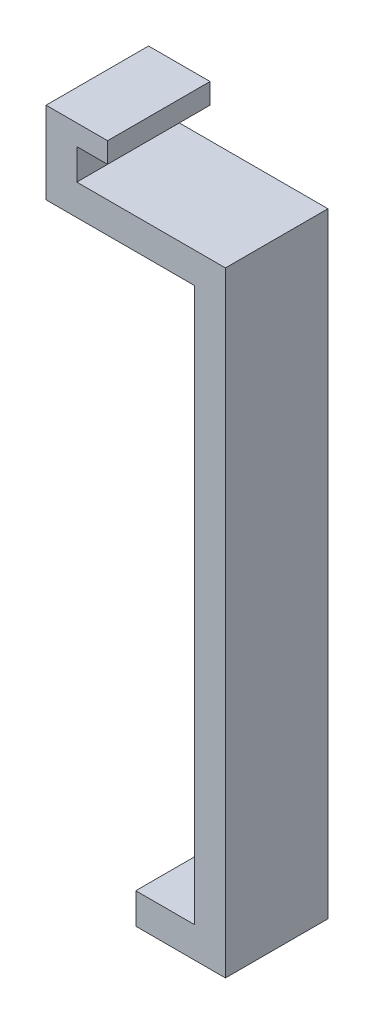
ISO-10303-21;
HEADER;
FILE_DESCRIPTION(('STEP AP214'),'2;1');
FILE_NAME('part.step','',(''),(''),'','','');
FILE_SCHEMA(('AUTOMOTIVE_DESIGN { 1 0 10303 214 1 1 1 1 }'));
ENDSEC;
DATA;
#1=APPLICATION_CONTEXT('core data for automotive mechanical design processes');
#2=APPLICATION_PROTOCOL_DEFINITION('international standard','automotive_design',2000,#1);
#3=PRODUCT_CONTEXT('',#1,'mechanical');
#4=PRODUCT('Part','Part','',(#3));
#5=PRODUCT_RELATED_PRODUCT_CATEGORY('part','',(#4));
#6=PRODUCT_DEFINITION_FORMATION('','',#4);
#7=PRODUCT_DEFINITION_CONTEXT('part definition',#1,'design');
#8=PRODUCT_DEFINITION('design','',#6,#7);
#9=PRODUCT_DEFINITION_SHAPE('','',#8);
#10=(LENGTH_UNIT() NAMED_UNIT(*) SI_UNIT(.MILLI.,.METRE.));
#11=(NAMED_UNIT(*) PLANE_ANGLE_UNIT() SI_UNIT($,.RADIAN.));
#12=(NAMED_UNIT(*) SI_UNIT($,.STERADIAN.) SOLID_ANGLE_UNIT());
#13=UNCERTAINTY_MEASURE_WITH_UNIT(LENGTH_MEASURE(1.E-05),#10,'distance_accuracy_value','');
#14=(GEOMETRIC_REPRESENTATION_CONTEXT(3) GLOBAL_UNCERTAINTY_ASSIGNED_CONTEXT((#13)) GLOBAL_UNIT_ASSIGNED_CONTEXT((#10,
#11,#12)) REPRESENTATION_CONTEXT('',''));
#15=CARTESIAN_POINT('',(0.,0.,0.));
#16=DIRECTION('',(0.,0.,1.));
#17=DIRECTION('',(1.,0.,0.));
#18=AXIS2_PLACEMENT_3D('',#15,#16,#17);
#19=CARTESIAN_POINT('',(-18.2298401554862,32.,10.));
#20=DIRECTION('',(0.,-1.,0.));
#21=DIRECTION('',(0.,0.,-1.));
#22=AXIS2_PLACEMENT_3D('',#19,#20,#21);
#23=PLANE('',#22);
#24=DIRECTION('',(-1.,0.,0.));
#25=VECTOR('',#24,1.);
#26=CARTESIAN_POINT('',(-18.2298401554862,32.,0.));
#27=LINE('',#26,#25);
#28=CARTESIAN_POINT('',(-12.2298401554862,32.,0.));
#29=VERTEX_POINT('',#28);
#30=CARTESIAN_POINT('',(-18.2298401554862,32.,0.));
#31=VERTEX_POINT('',#30);
#32=EDGE_CURVE('E164',#29,#31,#27,.T.);
#33=ORIENTED_EDGE('',*,*,#32,.T.);
#34=DIRECTION('',(0.,0.,-1.));
#35=VECTOR('',#34,1.);
#36=CARTESIAN_POINT('',(-18.2298401554862,32.,10.));
#37=LINE('',#36,#35);
#38=CARTESIAN_POINT('',(-18.2298401554862,32.,10.));
#39=VERTEX_POINT('',#38);
#40=EDGE_CURVE('E11',#39,#31,#37,.T.);
#41=ORIENTED_EDGE('',*,*,#40,.F.);
#42=DIRECTION('',(-1.,0.,0.));
#43=VECTOR('',#42,1.);
#44=CARTESIAN_POINT('',(-18.2298401554862,32.,10.));
#45=LINE('',#44,#43);
#46=CARTESIAN_POINT('',(-12.2298401554862,32.,10.));
#47=VERTEX_POINT('',#46);
#48=EDGE_CURVE('E200',#47,#39,#45,.T.);
#49=ORIENTED_EDGE('',*,*,#48,.F.);
#50=DIRECTION('',(0.,0.,-1.));
#51=VECTOR('',#50,1.);
#52=CARTESIAN_POINT('',(-12.2298401554862,32.,10.));
#53=LINE('',#52,#51);
#54=EDGE_CURVE('E160',#47,#29,#53,.T.);
#55=ORIENTED_EDGE('',*,*,#54,.T.);
#56=EDGE_LOOP('',(#33,#41,#49,#55));
#57=FACE_BOUND('',#56,.T.);
#58=ADVANCED_FACE('F39',(#57),#23,.F.);
#59=CARTESIAN_POINT('',(-18.2298401554862,32.,10.));
#60=DIRECTION('',(1.,0.,0.));
#61=DIRECTION('',(0.,0.,-1.));
#62=AXIS2_PLACEMENT_3D('',#59,#60,#61);
#63=PLANE('',#62);
#64=DIRECTION('',(0.,-1.,0.));
#65=VECTOR('',#64,1.);
#66=CARTESIAN_POINT('',(-18.2298401554862,32.,0.));
#67=LINE('',#66,#65);
#68=CARTESIAN_POINT('',(-18.2298401554862,24.,0.));
#69=VERTEX_POINT('',#68);
#70=EDGE_CURVE('E168',#31,#69,#67,.T.);
#71=ORIENTED_EDGE('',*,*,#70,.T.);
#72=DIRECTION('',(0.,0.,-1.));
#73=VECTOR('',#72,1.);
#74=CARTESIAN_POINT('',(-18.2298401554862,24.,10.));
#75=LINE('',#74,#73);
#76=CARTESIAN_POINT('',(-18.2298401554862,24.,10.));
#77=VERTEX_POINT('',#76);
#78=EDGE_CURVE('E48',#77,#69,#75,.T.);
#79=ORIENTED_EDGE('',*,*,#78,.F.);
#80=DIRECTION('',(0.,-1.,0.));
#81=VECTOR('',#80,1.);
#82=CARTESIAN_POINT('',(-18.2298401554862,32.,10.));
#83=LINE('',#82,#81);
#84=EDGE_CURVE('E111',#39,#77,#83,.T.);
#85=ORIENTED_EDGE('',*,*,#84,.F.);
#86=ORIENTED_EDGE('',*,*,#40,.T.);
#87=EDGE_LOOP('',(#71,#79,#85,#86));
#88=FACE_BOUND('',#87,.T.);
#89=ADVANCED_FACE('F292',(#88),#63,.F.);
#90=CARTESIAN_POINT('',(-18.2298401554862,24.,10.));
#91=DIRECTION('',(0.,1.,0.));
#92=DIRECTION('',(0.,0.,1.));
#93=AXIS2_PLACEMENT_3D('',#90,#91,#92);
#94=PLANE('',#93);
#95=DIRECTION('',(1.,0.,0.));
#96=VECTOR('',#95,1.);
#97=CARTESIAN_POINT('',(-18.2298401554862,24.,0.));
#98=LINE('',#97,#96);
#99=CARTESIAN_POINT('',(-3.72984015548622,24.,0.));
#100=VERTEX_POINT('',#99);
#101=EDGE_CURVE('E171',#69,#100,#98,.T.);
#102=ORIENTED_EDGE('',*,*,#101,.T.);
#103=DIRECTION('',(0.,0.,-1.));
#104=VECTOR('',#103,1.);
#105=CARTESIAN_POINT('',(-3.72984015548622,24.,10.));
#106=LINE('',#105,#104);
#107=CARTESIAN_POINT('',(-3.72984015548622,24.,10.));
#108=VERTEX_POINT('',#107);
#109=EDGE_CURVE('E227',#108,#100,#106,.T.);
#110=ORIENTED_EDGE('',*,*,#109,.F.);
#111=DIRECTION('',(1.,0.,0.));
#112=VECTOR('',#111,1.);
#113=CARTESIAN_POINT('',(-18.2298401554862,24.,10.));
#114=LINE('',#113,#112);
#115=EDGE_CURVE('E237',#77,#108,#114,.T.);
#116=ORIENTED_EDGE('',*,*,#115,.F.);
#117=ORIENTED_EDGE('',*,*,#78,.T.);
#118=EDGE_LOOP('',(#102,#110,#116,#117));
#119=FACE_BOUND('',#118,.T.);
#120=ADVANCED_FACE('F235',(#119),#94,.F.);
#121=CARTESIAN_POINT('',(-3.72984015548622,0.,10.));
#122=DIRECTION('',(1.,0.,0.));
#123=DIRECTION('',(0.,1.,0.));
#124=AXIS2_PLACEMENT_3D('',#121,#122,#123);
#125=PLANE('',#124);
#126=DIRECTION('',(0.,-1.,0.));
#127=VECTOR('',#126,1.);
#128=CARTESIAN_POINT('',(-3.72984015548622,0.,0.));
#129=LINE('',#128,#127);
#130=CARTESIAN_POINT('',(-3.72984015548621,-30.,0.));
#131=VERTEX_POINT('',#130);
#132=EDGE_CURVE('E175',#100,#131,#129,.T.);
#133=ORIENTED_EDGE('',*,*,#132,.T.);
#134=DIRECTION('',(0.,0.,-1.));
#135=VECTOR('',#134,1.);
#136=CARTESIAN_POINT('',(-3.72984015548621,-30.,10.));
#137=LINE('',#136,#135);
#138=CARTESIAN_POINT('',(-3.72984015548621,-30.,10.));
#139=VERTEX_POINT('',#138);
#140=EDGE_CURVE('E223',#139,#131,#137,.T.);
#141=ORIENTED_EDGE('',*,*,#140,.F.);
#142=DIRECTION('',(0.,-1.,0.));
#143=VECTOR('',#142,1.);
#144=CARTESIAN_POINT('',(-3.72984015548622,24.,10.));
#145=LINE('',#144,#143);
#146=EDGE_CURVE('E255',#108,#139,#145,.T.);
#147=ORIENTED_EDGE('',*,*,#146,.F.);
#148=ORIENTED_EDGE('',*,*,#109,.T.);
#149=EDGE_LOOP('',(#133,#141,#147,#148));
#150=FACE_BOUND('',#149,.T.);
#151=ADVANCED_FACE('F245',(#150),#125,.F.);
#152=CARTESIAN_POINT('',(-3.72984015548621,-30.,10.));
#153=DIRECTION('',(0.,-1.,0.));
#154=DIRECTION('',(0.,0.,-1.));
#155=AXIS2_PLACEMENT_3D('',#152,#153,#154);
#156=PLANE('',#155);
#157=DIRECTION('',(-1.,0.,0.));
#158=VECTOR('',#157,1.);
#159=CARTESIAN_POINT('',(-3.72984015548621,-30.,0.));
#160=LINE('',#159,#158);
#161=CARTESIAN_POINT('',(-9.47984015548623,-30.,0.));
#162=VERTEX_POINT('',#161);
#163=EDGE_CURVE('E178',#131,#162,#160,.T.);
#164=ORIENTED_EDGE('',*,*,#163,.T.);
#165=DIRECTION('',(0.,0.,-1.));
#166=VECTOR('',#165,1.);
#167=CARTESIAN_POINT('',(-9.47984015548623,-30.,10.));
#168=LINE('',#167,#166);
#169=CARTESIAN_POINT('',(-9.47984015548623,-30.,10.));
#170=VERTEX_POINT('',#169);
#171=EDGE_CURVE('E219',#170,#162,#168,.T.);
#172=ORIENTED_EDGE('',*,*,#171,.F.);
#173=DIRECTION('',(-1.,0.,0.));
#174=VECTOR('',#173,1.);
#175=CARTESIAN_POINT('',(-3.72984015548621,-30.,10.));
#176=LINE('',#175,#174);
#177=EDGE_CURVE('E251',#139,#170,#176,.T.);
#178=ORIENTED_EDGE('',*,*,#177,.F.);
#179=ORIENTED_EDGE('',*,*,#140,.T.);
#180=EDGE_LOOP('',(#164,#172,#178,#179));
#181=FACE_BOUND('',#180,.T.);
#182=ADVANCED_FACE('F249',(#181),#156,.F.);
#183=CARTESIAN_POINT('',(-9.47984015548623,-33.,10.));
#184=DIRECTION('',(1.,0.,0.));
#185=DIRECTION('',(0.,0.,-1.));
#186=AXIS2_PLACEMENT_3D('',#183,#184,#185);
#187=PLANE('',#186);
#188=DIRECTION('',(0.,-1.,0.));
#189=VECTOR('',#188,1.);
#190=CARTESIAN_POINT('',(-9.47984015548623,-33.,0.));
#191=LINE('',#190,#189);
#192=CARTESIAN_POINT('',(-9.47984015548623,-33.,0.));
#193=VERTEX_POINT('',#192);
#194=EDGE_CURVE('E181',#162,#193,#191,.T.);
#195=ORIENTED_EDGE('',*,*,#194,.T.);
#196=DIRECTION('',(0.,0.,-1.));
#197=VECTOR('',#196,1.);
#198=CARTESIAN_POINT('',(-9.47984015548623,-33.,10.));
#199=LINE('',#198,#197);
#200=CARTESIAN_POINT('',(-9.47984015548623,-33.,10.));
#201=VERTEX_POINT('',#200);
#202=EDGE_CURVE('E215',#201,#193,#199,.T.);
#203=ORIENTED_EDGE('',*,*,#202,.F.);
#204=DIRECTION('',(0.,-1.,0.));
#205=VECTOR('',#204,1.);
#206=CARTESIAN_POINT('',(-9.47984015548623,-33.,10.));
#207=LINE('',#206,#205);
#208=EDGE_CURVE('E254',#170,#201,#207,.T.);
#209=ORIENTED_EDGE('',*,*,#208,.F.);
#210=ORIENTED_EDGE('',*,*,#171,.T.);
#211=EDGE_LOOP('',(#195,#203,#209,#210));
#212=FACE_BOUND('',#211,.T.);
#213=ADVANCED_FACE('F305',(#212),#187,.F.);
#214=CARTESIAN_POINT('',(-0.729840155486213,-33.,10.));
#215=DIRECTION('',(0.,1.,0.));
#216=DIRECTION('',(0.,0.,1.));
#217=AXIS2_PLACEMENT_3D('',#214,#215,#216);
#218=PLANE('',#217);
#219=DIRECTION('',(1.,0.,0.));
#220=VECTOR('',#219,1.);
#221=CARTESIAN_POINT('',(-0.729840155486213,-33.,0.));
#222=LINE('',#221,#220);
#223=CARTESIAN_POINT('',(-0.729840155486213,-33.,0.));
#224=VERTEX_POINT('',#223);
#225=EDGE_CURVE('E184',#193,#224,#222,.T.);
#226=ORIENTED_EDGE('',*,*,#225,.T.);
#227=DIRECTION('',(0.,0.,-1.));
#228=VECTOR('',#227,1.);
#229=CARTESIAN_POINT('',(-0.729840155486213,-33.,10.));
#230=LINE('',#229,#228);
#231=CARTESIAN_POINT('',(-0.729840155486213,-33.,10.));
#232=VERTEX_POINT('',#231);
#233=EDGE_CURVE('E211',#232,#224,#230,.T.);
#234=ORIENTED_EDGE('',*,*,#233,.F.);
#235=DIRECTION('',(1.,0.,0.));
#236=VECTOR('',#235,1.);
#237=CARTESIAN_POINT('',(-0.729840155486213,-33.,10.));
#238=LINE('',#237,#236);
#239=EDGE_CURVE('E259',#201,#232,#238,.T.);
#240=ORIENTED_EDGE('',*,*,#239,.F.);
#241=ORIENTED_EDGE('',*,*,#202,.T.);
#242=EDGE_LOOP('',(#226,#234,#240,#241));
#243=FACE_BOUND('',#242,.T.);
#244=ADVANCED_FACE('F308',(#243),#218,.F.);
#245=CARTESIAN_POINT('',(-0.72984015548622,27.,10.));
#246=DIRECTION('',(-1.,0.,0.));
#247=DIRECTION('',(0.,-1.,0.));
#248=AXIS2_PLACEMENT_3D('',#245,#246,#247);
#249=PLANE('',#248);
#250=DIRECTION('',(0.,1.,0.));
#251=VECTOR('',#250,1.);
#252=CARTESIAN_POINT('',(-0.72984015548622,27.,0.));
#253=LINE('',#252,#251);
#254=CARTESIAN_POINT('',(-0.72984015548622,27.,0.));
#255=VERTEX_POINT('',#254);
#256=EDGE_CURVE('E188',#224,#255,#253,.T.);
#257=ORIENTED_EDGE('',*,*,#256,.T.);
#258=DIRECTION('',(0.,0.,-1.));
#259=VECTOR('',#258,1.);
#260=CARTESIAN_POINT('',(-0.72984015548622,27.,10.));
#261=LINE('',#260,#259);
#262=CARTESIAN_POINT('',(-0.72984015548622,27.,10.));
#263=VERTEX_POINT('',#262);
#264=EDGE_CURVE('E207',#263,#255,#261,.T.);
#265=ORIENTED_EDGE('',*,*,#264,.F.);
#266=DIRECTION('',(0.,1.,0.));
#267=VECTOR('',#266,1.);
#268=CARTESIAN_POINT('',(-0.729840155486217,0.,10.));
#269=LINE('',#268,#267);
#270=EDGE_CURVE('E266',#232,#263,#269,.T.);
#271=ORIENTED_EDGE('',*,*,#270,.F.);
#272=ORIENTED_EDGE('',*,*,#233,.T.);
#273=EDGE_LOOP('',(#257,#265,#271,#272));
#274=FACE_BOUND('',#273,.T.);
#275=ADVANCED_FACE('F274',(#274),#249,.F.);
#276=CARTESIAN_POINT('',(-15.2298401554862,27.,10.));
#277=DIRECTION('',(0.,-1.,0.));
#278=DIRECTION('',(1.,0.,0.));
#279=AXIS2_PLACEMENT_3D('',#276,#277,#278);
#280=PLANE('',#279);
#281=DIRECTION('',(-1.,0.,0.));
#282=VECTOR('',#281,1.);
#283=CARTESIAN_POINT('',(-15.2298401554862,27.,0.));
#284=LINE('',#283,#282);
#285=CARTESIAN_POINT('',(-15.2298401554862,27.,0.));
#286=VERTEX_POINT('',#285);
#287=EDGE_CURVE('E191',#255,#286,#284,.T.);
#288=ORIENTED_EDGE('',*,*,#287,.T.);
#289=DIRECTION('',(0.,0.,-1.));
#290=VECTOR('',#289,1.);
#291=CARTESIAN_POINT('',(-15.2298401554862,27.,10.));
#292=LINE('',#291,#290);
#293=CARTESIAN_POINT('',(-15.2298401554862,27.,10.));
#294=VERTEX_POINT('',#293);
#295=EDGE_CURVE('E153',#294,#286,#292,.T.);
#296=ORIENTED_EDGE('',*,*,#295,.F.);
#297=DIRECTION('',(-1.,0.,0.));
#298=VECTOR('',#297,1.);
#299=CARTESIAN_POINT('',(-15.2298401554862,27.,10.));
#300=LINE('',#299,#298);
#301=EDGE_CURVE('E142',#263,#294,#300,.T.);
#302=ORIENTED_EDGE('',*,*,#301,.F.);
#303=ORIENTED_EDGE('',*,*,#264,.T.);
#304=EDGE_LOOP('',(#288,#296,#302,#303));
#305=FACE_BOUND('',#304,.T.);
#306=ADVANCED_FACE('F277',(#305),#280,.F.);
#307=CARTESIAN_POINT('',(-15.2298401554862,30.,10.));
#308=DIRECTION('',(-1.,0.,0.));
#309=DIRECTION('',(0.,-1.,0.));
#310=AXIS2_PLACEMENT_3D('',#307,#308,#309);
#311=PLANE('',#310);
#312=DIRECTION('',(0.,1.,0.));
#313=VECTOR('',#312,1.);
#314=CARTESIAN_POINT('',(-15.2298401554862,30.,0.));
#315=LINE('',#314,#313);
#316=CARTESIAN_POINT('',(-15.2298401554862,30.,0.));
#317=VERTEX_POINT('',#316);
#318=EDGE_CURVE('E151',#286,#317,#315,.T.);
#319=ORIENTED_EDGE('',*,*,#318,.T.);
#320=DIRECTION('',(0.,0.,-1.));
#321=VECTOR('',#320,1.);
#322=CARTESIAN_POINT('',(-15.2298401554862,30.,10.));
#323=LINE('',#322,#321);
#324=CARTESIAN_POINT('',(-15.2298401554862,30.,10.));
#325=VERTEX_POINT('',#324);
#326=EDGE_CURVE('E148',#325,#317,#323,.T.);
#327=ORIENTED_EDGE('',*,*,#326,.F.);
#328=DIRECTION('',(0.,1.,0.));
#329=VECTOR('',#328,1.);
#330=CARTESIAN_POINT('',(-15.2298401554862,30.,10.));
#331=LINE('',#330,#329);
#332=EDGE_CURVE('E136',#294,#325,#331,.T.);
#333=ORIENTED_EDGE('',*,*,#332,.F.);
#334=ORIENTED_EDGE('',*,*,#295,.T.);
#335=EDGE_LOOP('',(#319,#327,#333,#334));
#336=FACE_BOUND('',#335,.T.);
#337=ADVANCED_FACE('F149',(#336),#311,.F.);
#338=CARTESIAN_POINT('',(-12.2298401554862,30.,10.));
#339=DIRECTION('',(0.,1.,0.));
#340=DIRECTION('',(0.,0.,1.));
#341=AXIS2_PLACEMENT_3D('',#338,#339,#340);
#342=PLANE('',#341);
#343=DIRECTION('',(1.,0.,0.));
#344=VECTOR('',#343,1.);
#345=CARTESIAN_POINT('',(-12.2298401554862,30.,0.));
#346=LINE('',#345,#344);
#347=CARTESIAN_POINT('',(-12.2298401554862,30.,0.));
#348=VERTEX_POINT('',#347);
#349=EDGE_CURVE('E97',#317,#348,#346,.T.);
#350=ORIENTED_EDGE('',*,*,#349,.T.);
#351=DIRECTION('',(0.,0.,-1.));
#352=VECTOR('',#351,1.);
#353=CARTESIAN_POINT('',(-12.2298401554862,30.,10.));
#354=LINE('',#353,#352);
#355=CARTESIAN_POINT('',(-12.2298401554862,30.,10.));
#356=VERTEX_POINT('',#355);
#357=EDGE_CURVE('E154',#356,#348,#354,.T.);
#358=ORIENTED_EDGE('',*,*,#357,.F.);
#359=DIRECTION('',(1.,0.,0.));
#360=VECTOR('',#359,1.);
#361=CARTESIAN_POINT('',(-12.2298401554862,30.,10.));
#362=LINE('',#361,#360);
#363=EDGE_CURVE('E140',#325,#356,#362,.T.);
#364=ORIENTED_EDGE('',*,*,#363,.F.);
#365=ORIENTED_EDGE('',*,*,#326,.T.);
#366=EDGE_LOOP('',(#350,#358,#364,#365));
#367=FACE_BOUND('',#366,.T.);
#368=ADVANCED_FACE('F156',(#367),#342,.F.);
#369=CARTESIAN_POINT('',(-12.2298401554862,32.,10.));
#370=DIRECTION('',(-1.,0.,0.));
#371=DIRECTION('',(0.,0.,1.));
#372=AXIS2_PLACEMENT_3D('',#369,#370,#371);
#373=PLANE('',#372);
#374=DIRECTION('',(0.,1.,0.));
#375=VECTOR('',#374,1.);
#376=CARTESIAN_POINT('',(-12.2298401554862,32.,0.));
#377=LINE('',#376,#375);
#378=EDGE_CURVE('E103',#348,#29,#377,.T.);
#379=ORIENTED_EDGE('',*,*,#378,.T.);
#380=ORIENTED_EDGE('',*,*,#54,.F.);
#381=DIRECTION('',(0.,1.,0.));
#382=VECTOR('',#381,1.);
#383=CARTESIAN_POINT('',(-12.2298401554862,32.,10.));
#384=LINE('',#383,#382);
#385=EDGE_CURVE('E56',#356,#47,#384,.T.);
#386=ORIENTED_EDGE('',*,*,#385,.F.);
#387=ORIENTED_EDGE('',*,*,#357,.T.);
#388=EDGE_LOOP('',(#379,#380,#386,#387));
#389=FACE_BOUND('',#388,.T.);
#390=ADVANCED_FACE('F281',(#389),#373,.F.);
#391=CARTESIAN_POINT('',(0.,0.,10.));
#392=DIRECTION('',(0.,0.,-1.));
#393=DIRECTION('',(-1.,0.,0.));
#394=AXIS2_PLACEMENT_3D('',#391,#392,#393);
#395=PLANE('',#394);
#396=ORIENTED_EDGE('',*,*,#48,.T.);
#397=ORIENTED_EDGE('',*,*,#84,.T.);
#398=ORIENTED_EDGE('',*,*,#115,.T.);
#399=ORIENTED_EDGE('',*,*,#146,.T.);
#400=ORIENTED_EDGE('',*,*,#177,.T.);
#401=ORIENTED_EDGE('',*,*,#208,.T.);
#402=ORIENTED_EDGE('',*,*,#239,.T.);
#403=ORIENTED_EDGE('',*,*,#270,.T.);
#404=ORIENTED_EDGE('',*,*,#301,.T.);
#405=ORIENTED_EDGE('',*,*,#332,.T.);
#406=ORIENTED_EDGE('',*,*,#363,.T.);
#407=ORIENTED_EDGE('',*,*,#385,.T.);
#408=EDGE_LOOP('',(#396,#397,#398,#399,#400,#401,#402,#403,#404,#405,#406,#407));
#409=FACE_BOUND('',#408,.T.);
#410=ADVANCED_FACE('F138',(#409),#395,.F.);
#411=CARTESIAN_POINT('',(0.,0.,0.));
#412=DIRECTION('',(0.,0.,-1.));
#413=DIRECTION('',(-1.,0.,0.));
#414=AXIS2_PLACEMENT_3D('',#411,#412,#413);
#415=PLANE('',#414);
#416=ORIENTED_EDGE('',*,*,#32,.F.);
#417=ORIENTED_EDGE('',*,*,#378,.F.);
#418=ORIENTED_EDGE('',*,*,#349,.F.);
#419=ORIENTED_EDGE('',*,*,#318,.F.);
#420=ORIENTED_EDGE('',*,*,#287,.F.);
#421=ORIENTED_EDGE('',*,*,#256,.F.);
#422=ORIENTED_EDGE('',*,*,#225,.F.);
#423=ORIENTED_EDGE('',*,*,#194,.F.);
#424=ORIENTED_EDGE('',*,*,#163,.F.);
#425=ORIENTED_EDGE('',*,*,#132,.F.);
#426=ORIENTED_EDGE('',*,*,#101,.F.);
#427=ORIENTED_EDGE('',*,*,#70,.F.);
#428=EDGE_LOOP('',(#416,#417,#418,#419,#420,#421,#422,#423,#424,#425,#426,#427));
#429=FACE_BOUND('',#428,.T.);
#430=ADVANCED_FACE('F240',(#429),#415,.T.);
#431=CLOSED_SHELL('',(#58,#89,#120,#151,#182,#213,#244,#275,#306,#337,#368,#390,#410,#430));
#432=MANIFOLD_SOLID_BREP('B2',#431);
#433=ADVANCED_BREP_SHAPE_REPRESENTATION('',(#18,#432),#14);
#434=SHAPE_DEFINITION_REPRESENTATION(#9,#433);
ENDSEC;
END-ISO-10303-21;
